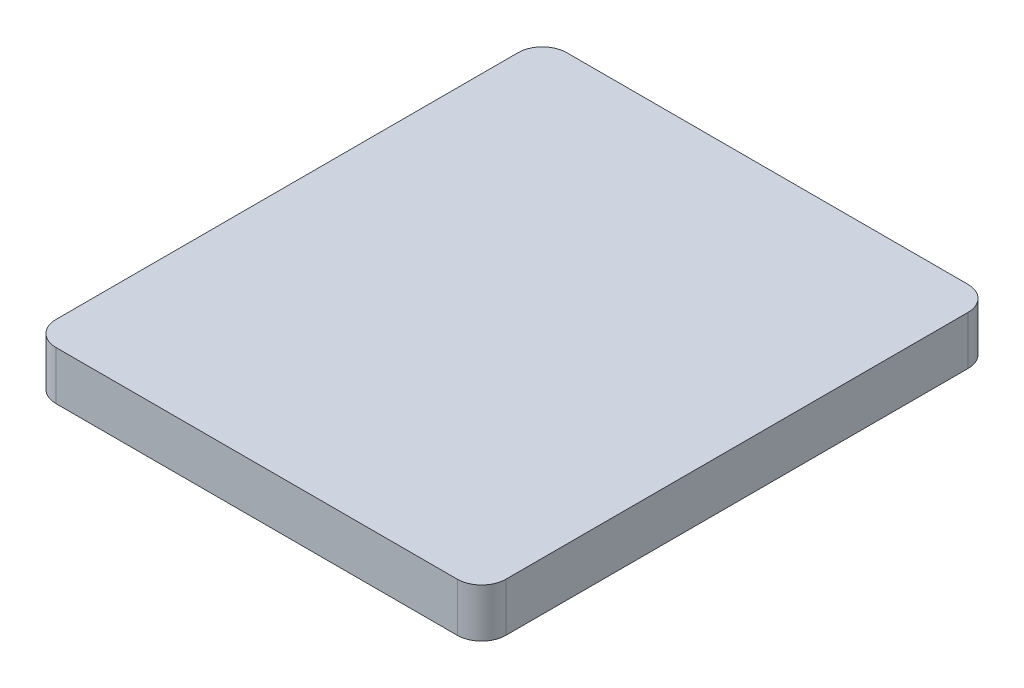
ISO-10303-21;
HEADER;
FILE_DESCRIPTION(('STEP AP214'),'2;1');
FILE_NAME('part.step','',(''),(''),'','','');
FILE_SCHEMA(('AUTOMOTIVE_DESIGN { 1 0 10303 214 1 1 1 1 }'));
ENDSEC;
DATA;
#1=APPLICATION_CONTEXT('core data for automotive mechanical design processes');
#2=APPLICATION_PROTOCOL_DEFINITION('international standard','automotive_design',2000,#1);
#3=PRODUCT_CONTEXT('',#1,'mechanical');
#4=PRODUCT('Part','Part','',(#3));
#5=PRODUCT_RELATED_PRODUCT_CATEGORY('part','',(#4));
#6=PRODUCT_DEFINITION_FORMATION('','',#4);
#7=PRODUCT_DEFINITION_CONTEXT('part definition',#1,'design');
#8=PRODUCT_DEFINITION('design','',#6,#7);
#9=PRODUCT_DEFINITION_SHAPE('','',#8);
#10=(LENGTH_UNIT() NAMED_UNIT(*) SI_UNIT(.MILLI.,.METRE.));
#11=(NAMED_UNIT(*) PLANE_ANGLE_UNIT() SI_UNIT($,.RADIAN.));
#12=(NAMED_UNIT(*) SI_UNIT($,.STERADIAN.) SOLID_ANGLE_UNIT());
#13=UNCERTAINTY_MEASURE_WITH_UNIT(LENGTH_MEASURE(1.E-05),#10,'distance_accuracy_value','');
#14=(GEOMETRIC_REPRESENTATION_CONTEXT(3) GLOBAL_UNCERTAINTY_ASSIGNED_CONTEXT((#13)) GLOBAL_UNIT_ASSIGNED_CONTEXT((#10,
#11,#12)) REPRESENTATION_CONTEXT('',''));
#15=CARTESIAN_POINT('',(0.,0.,0.));
#16=DIRECTION('',(0.,0.,1.));
#17=DIRECTION('',(1.,0.,0.));
#18=AXIS2_PLACEMENT_3D('',#15,#16,#17);
#19=CARTESIAN_POINT('',(0.,2.,0.));
#20=DIRECTION('',(1.,0.,0.));
#21=DIRECTION('',(0.,0.,-1.));
#22=AXIS2_PLACEMENT_3D('',#19,#20,#21);
#23=PLANE('',#22);
#24=DIRECTION('',(0.,0.,1.));
#25=VECTOR('',#24,1.);
#26=CARTESIAN_POINT('',(0.,2.,0.));
#27=LINE('',#26,#25);
#28=CARTESIAN_POINT('',(0.,2.,-20.));
#29=VERTEX_POINT('',#28);
#30=CARTESIAN_POINT('',(0.,2.,-1.));
#31=VERTEX_POINT('',#30);
#32=EDGE_CURVE('E123',#29,#31,#27,.T.);
#33=ORIENTED_EDGE('',*,*,#32,.F.);
#34=DIRECTION('',(0.,-1.,0.));
#35=VECTOR('',#34,1.);
#36=CARTESIAN_POINT('',(0.,2.,-20.));
#37=LINE('',#36,#35);
#38=CARTESIAN_POINT('',(0.,0.,-20.));
#39=VERTEX_POINT('',#38);
#40=EDGE_CURVE('E108',#29,#39,#37,.T.);
#41=ORIENTED_EDGE('',*,*,#40,.T.);
#42=DIRECTION('',(0.,0.,1.));
#43=VECTOR('',#42,1.);
#44=CARTESIAN_POINT('',(0.,0.,0.));
#45=LINE('',#44,#43);
#46=CARTESIAN_POINT('',(0.,0.,-1.));
#47=VERTEX_POINT('',#46);
#48=EDGE_CURVE('E120',#39,#47,#45,.T.);
#49=ORIENTED_EDGE('',*,*,#48,.T.);
#50=DIRECTION('',(0.,-1.,0.));
#51=VECTOR('',#50,1.);
#52=CARTESIAN_POINT('',(0.,2.,-1.));
#53=LINE('',#52,#51);
#54=EDGE_CURVE('E125',#47,#31,#53,.F.);
#55=ORIENTED_EDGE('',*,*,#54,.T.);
#56=EDGE_LOOP('',(#33,#41,#49,#55));
#57=FACE_BOUND('',#56,.T.);
#58=ADVANCED_FACE('F38',(#57),#23,.F.);
#59=CARTESIAN_POINT('',(0.,2.,0.));
#60=DIRECTION('',(0.,0.,-1.));
#61=DIRECTION('',(-1.,0.,0.));
#62=AXIS2_PLACEMENT_3D('',#59,#60,#61);
#63=PLANE('',#62);
#64=DIRECTION('',(1.,0.,0.));
#65=VECTOR('',#64,1.);
#66=CARTESIAN_POINT('',(0.,0.,0.));
#67=LINE('',#66,#65);
#68=CARTESIAN_POINT('',(1.,0.,0.));
#69=VERTEX_POINT('',#68);
#70=CARTESIAN_POINT('',(17.5,0.,0.));
#71=VERTEX_POINT('',#70);
#72=EDGE_CURVE('E129',#69,#71,#67,.T.);
#73=ORIENTED_EDGE('',*,*,#72,.T.);
#74=DIRECTION('',(0.,-1.,0.));
#75=VECTOR('',#74,1.);
#76=CARTESIAN_POINT('',(17.5,2.,0.));
#77=LINE('',#76,#75);
#78=CARTESIAN_POINT('',(17.5,2.,0.));
#79=VERTEX_POINT('',#78);
#80=EDGE_CURVE('E11',#71,#79,#77,.F.);
#81=ORIENTED_EDGE('',*,*,#80,.T.);
#82=DIRECTION('',(1.,0.,0.));
#83=VECTOR('',#82,1.);
#84=CARTESIAN_POINT('',(0.,2.,0.));
#85=LINE('',#84,#83);
#86=CARTESIAN_POINT('',(1.,2.,0.));
#87=VERTEX_POINT('',#86);
#88=EDGE_CURVE('E165',#87,#79,#85,.T.);
#89=ORIENTED_EDGE('',*,*,#88,.F.);
#90=DIRECTION('',(0.,-1.,0.));
#91=VECTOR('',#90,1.);
#92=CARTESIAN_POINT('',(1.,2.,0.));
#93=LINE('',#92,#91);
#94=EDGE_CURVE('E46',#87,#69,#93,.T.);
#95=ORIENTED_EDGE('',*,*,#94,.T.);
#96=EDGE_LOOP('',(#73,#81,#89,#95));
#97=FACE_BOUND('',#96,.T.);
#98=ADVANCED_FACE('F163',(#97),#63,.F.);
#99=CARTESIAN_POINT('',(18.5,2.,0.));
#100=DIRECTION('',(-1.,0.,0.));
#101=DIRECTION('',(0.,0.,1.));
#102=AXIS2_PLACEMENT_3D('',#99,#100,#101);
#103=PLANE('',#102);
#104=DIRECTION('',(0.,0.,-1.));
#105=VECTOR('',#104,1.);
#106=CARTESIAN_POINT('',(18.5,0.,0.));
#107=LINE('',#106,#105);
#108=CARTESIAN_POINT('',(18.5,0.,-1.));
#109=VERTEX_POINT('',#108);
#110=CARTESIAN_POINT('',(18.5,0.,-20.));
#111=VERTEX_POINT('',#110);
#112=EDGE_CURVE('E132',#109,#111,#107,.T.);
#113=ORIENTED_EDGE('',*,*,#112,.T.);
#114=DIRECTION('',(0.,-1.,0.));
#115=VECTOR('',#114,1.);
#116=CARTESIAN_POINT('',(18.5,2.,-20.));
#117=LINE('',#116,#115);
#118=CARTESIAN_POINT('',(18.5,2.,-20.));
#119=VERTEX_POINT('',#118);
#120=EDGE_CURVE('E53',#111,#119,#117,.F.);
#121=ORIENTED_EDGE('',*,*,#120,.T.);
#122=DIRECTION('',(0.,0.,-1.));
#123=VECTOR('',#122,1.);
#124=CARTESIAN_POINT('',(18.5,2.,0.));
#125=LINE('',#124,#123);
#126=CARTESIAN_POINT('',(18.5,2.,-1.));
#127=VERTEX_POINT('',#126);
#128=EDGE_CURVE('E173',#127,#119,#125,.T.);
#129=ORIENTED_EDGE('',*,*,#128,.F.);
#130=DIRECTION('',(0.,-1.,0.));
#131=VECTOR('',#130,1.);
#132=CARTESIAN_POINT('',(18.5,2.,-1.));
#133=LINE('',#132,#131);
#134=EDGE_CURVE('E156',#127,#109,#133,.T.);
#135=ORIENTED_EDGE('',*,*,#134,.T.);
#136=EDGE_LOOP('',(#113,#121,#129,#135));
#137=FACE_BOUND('',#136,.T.);
#138=ADVANCED_FACE('F172',(#137),#103,.F.);
#139=CARTESIAN_POINT('',(0.,2.,-21.));
#140=DIRECTION('',(0.,0.,1.));
#141=DIRECTION('',(1.,0.,0.));
#142=AXIS2_PLACEMENT_3D('',#139,#140,#141);
#143=PLANE('',#142);
#144=DIRECTION('',(-1.,0.,0.));
#145=VECTOR('',#144,1.);
#146=CARTESIAN_POINT('',(0.,0.,-21.));
#147=LINE('',#146,#145);
#148=CARTESIAN_POINT('',(17.5,0.,-21.));
#149=VERTEX_POINT('',#148);
#150=CARTESIAN_POINT('',(1.,0.,-21.));
#151=VERTEX_POINT('',#150);
#152=EDGE_CURVE('E139',#149,#151,#147,.T.);
#153=ORIENTED_EDGE('',*,*,#152,.T.);
#154=DIRECTION('',(0.,-1.,0.));
#155=VECTOR('',#154,1.);
#156=CARTESIAN_POINT('',(1.,2.,-21.));
#157=LINE('',#156,#155);
#158=CARTESIAN_POINT('',(1.,2.,-21.));
#159=VERTEX_POINT('',#158);
#160=EDGE_CURVE('E109',#151,#159,#157,.F.);
#161=ORIENTED_EDGE('',*,*,#160,.T.);
#162=DIRECTION('',(-1.,0.,0.));
#163=VECTOR('',#162,1.);
#164=CARTESIAN_POINT('',(0.,2.,-21.));
#165=LINE('',#164,#163);
#166=CARTESIAN_POINT('',(17.5,2.,-21.));
#167=VERTEX_POINT('',#166);
#168=EDGE_CURVE('E135',#167,#159,#165,.T.);
#169=ORIENTED_EDGE('',*,*,#168,.F.);
#170=DIRECTION('',(0.,-1.,0.));
#171=VECTOR('',#170,1.);
#172=CARTESIAN_POINT('',(17.5,2.,-21.));
#173=LINE('',#172,#171);
#174=EDGE_CURVE('E114',#167,#149,#173,.T.);
#175=ORIENTED_EDGE('',*,*,#174,.T.);
#176=EDGE_LOOP('',(#153,#161,#169,#175));
#177=FACE_BOUND('',#176,.T.);
#178=ADVANCED_FACE('F201',(#177),#143,.F.);
#179=CARTESIAN_POINT('',(0.,2.,0.));
#180=DIRECTION('',(0.,-1.,0.));
#181=DIRECTION('',(0.,0.,-1.));
#182=AXIS2_PLACEMENT_3D('',#179,#180,#181);
#183=PLANE('',#182);
#184=ORIENTED_EDGE('',*,*,#168,.T.);
#185=CARTESIAN_POINT('',(1.,2.,-20.));
#186=DIRECTION('',(0.,-1.,0.));
#187=DIRECTION('',(0.,0.,-1.));
#188=AXIS2_PLACEMENT_3D('',#185,#186,#187);
#189=CIRCLE('',#188,1.);
#190=EDGE_CURVE('E154',#159,#29,#189,.F.);
#191=ORIENTED_EDGE('',*,*,#190,.T.);
#192=ORIENTED_EDGE('',*,*,#32,.T.);
#193=CARTESIAN_POINT('',(1.,2.,-1.));
#194=DIRECTION('',(0.,-1.,0.));
#195=DIRECTION('',(0.,0.,-1.));
#196=AXIS2_PLACEMENT_3D('',#193,#194,#195);
#197=CIRCLE('',#196,1.);
#198=EDGE_CURVE('E149',#31,#87,#197,.F.);
#199=ORIENTED_EDGE('',*,*,#198,.T.);
#200=ORIENTED_EDGE('',*,*,#88,.T.);
#201=CARTESIAN_POINT('',(17.5,2.,-1.));
#202=DIRECTION('',(0.,-1.,0.));
#203=DIRECTION('',(0.,0.,-1.));
#204=AXIS2_PLACEMENT_3D('',#201,#202,#203);
#205=CIRCLE('',#204,1.);
#206=EDGE_CURVE('E60',#79,#127,#205,.F.);
#207=ORIENTED_EDGE('',*,*,#206,.T.);
#208=ORIENTED_EDGE('',*,*,#128,.T.);
#209=CARTESIAN_POINT('',(17.5,2.,-20.));
#210=DIRECTION('',(0.,-1.,0.));
#211=DIRECTION('',(0.,0.,-1.));
#212=AXIS2_PLACEMENT_3D('',#209,#210,#211);
#213=CIRCLE('',#212,1.);
#214=EDGE_CURVE('E152',#119,#167,#213,.F.);
#215=ORIENTED_EDGE('',*,*,#214,.T.);
#216=EDGE_LOOP('',(#184,#191,#192,#199,#200,#207,#208,#215));
#217=FACE_BOUND('',#216,.T.);
#218=ADVANCED_FACE('F178',(#217),#183,.F.);
#219=CARTESIAN_POINT('',(0.,0.,0.));
#220=DIRECTION('',(0.,-1.,0.));
#221=DIRECTION('',(0.,0.,-1.));
#222=AXIS2_PLACEMENT_3D('',#219,#220,#221);
#223=PLANE('',#222);
#224=ORIENTED_EDGE('',*,*,#48,.F.);
#225=CARTESIAN_POINT('',(1.,0.,-20.));
#226=DIRECTION('',(0.,-1.,0.));
#227=DIRECTION('',(0.,0.,-1.));
#228=AXIS2_PLACEMENT_3D('',#225,#226,#227);
#229=CIRCLE('',#228,1.);
#230=EDGE_CURVE('E104',#39,#151,#229,.T.);
#231=ORIENTED_EDGE('',*,*,#230,.T.);
#232=ORIENTED_EDGE('',*,*,#152,.F.);
#233=CARTESIAN_POINT('',(17.5,0.,-20.));
#234=DIRECTION('',(0.,-1.,0.));
#235=DIRECTION('',(0.,0.,-1.));
#236=AXIS2_PLACEMENT_3D('',#233,#234,#235);
#237=CIRCLE('',#236,1.);
#238=EDGE_CURVE('E115',#149,#111,#237,.T.);
#239=ORIENTED_EDGE('',*,*,#238,.T.);
#240=ORIENTED_EDGE('',*,*,#112,.F.);
#241=CARTESIAN_POINT('',(17.5,0.,-1.));
#242=DIRECTION('',(0.,-1.,0.));
#243=DIRECTION('',(0.,0.,-1.));
#244=AXIS2_PLACEMENT_3D('',#241,#242,#243);
#245=CIRCLE('',#244,1.);
#246=EDGE_CURVE('E143',#109,#71,#245,.T.);
#247=ORIENTED_EDGE('',*,*,#246,.T.);
#248=ORIENTED_EDGE('',*,*,#72,.F.);
#249=CARTESIAN_POINT('',(1.,0.,-1.));
#250=DIRECTION('',(0.,-1.,0.));
#251=DIRECTION('',(0.,0.,-1.));
#252=AXIS2_PLACEMENT_3D('',#249,#250,#251);
#253=CIRCLE('',#252,1.);
#254=EDGE_CURVE('E124',#69,#47,#253,.T.);
#255=ORIENTED_EDGE('',*,*,#254,.T.);
#256=EDGE_LOOP('',(#224,#231,#232,#239,#240,#247,#248,#255));
#257=FACE_BOUND('',#256,.T.);
#258=ADVANCED_FACE('F127',(#257),#223,.T.);
#259=CARTESIAN_POINT('',(1.,2.,-20.));
#260=DIRECTION('',(0.,-1.,0.));
#261=DIRECTION('',(0.,0.,-1.));
#262=AXIS2_PLACEMENT_3D('',#259,#260,#261);
#263=CYLINDRICAL_SURFACE('',#262,1.);
#264=ORIENTED_EDGE('',*,*,#190,.F.);
#265=ORIENTED_EDGE('',*,*,#160,.F.);
#266=ORIENTED_EDGE('',*,*,#230,.F.);
#267=ORIENTED_EDGE('',*,*,#40,.F.);
#268=EDGE_LOOP('',(#264,#265,#266,#267));
#269=FACE_BOUND('',#268,.T.);
#270=ADVANCED_FACE('F107',(#269),#263,.T.);
#271=CARTESIAN_POINT('',(17.5,2.,-20.));
#272=DIRECTION('',(0.,-1.,0.));
#273=DIRECTION('',(0.,0.,-1.));
#274=AXIS2_PLACEMENT_3D('',#271,#272,#273);
#275=CYLINDRICAL_SURFACE('',#274,1.);
#276=ORIENTED_EDGE('',*,*,#214,.F.);
#277=ORIENTED_EDGE('',*,*,#120,.F.);
#278=ORIENTED_EDGE('',*,*,#238,.F.);
#279=ORIENTED_EDGE('',*,*,#174,.F.);
#280=EDGE_LOOP('',(#276,#277,#278,#279));
#281=FACE_BOUND('',#280,.T.);
#282=ADVANCED_FACE('F183',(#281),#275,.T.);
#283=CARTESIAN_POINT('',(17.5,2.,-1.));
#284=DIRECTION('',(0.,-1.,0.));
#285=DIRECTION('',(0.,0.,-1.));
#286=AXIS2_PLACEMENT_3D('',#283,#284,#285);
#287=CYLINDRICAL_SURFACE('',#286,1.);
#288=ORIENTED_EDGE('',*,*,#206,.F.);
#289=ORIENTED_EDGE('',*,*,#80,.F.);
#290=ORIENTED_EDGE('',*,*,#246,.F.);
#291=ORIENTED_EDGE('',*,*,#134,.F.);
#292=EDGE_LOOP('',(#288,#289,#290,#291));
#293=FACE_BOUND('',#292,.T.);
#294=ADVANCED_FACE('F171',(#293),#287,.T.);
#295=CARTESIAN_POINT('',(1.,2.,-1.));
#296=DIRECTION('',(0.,-1.,0.));
#297=DIRECTION('',(0.,0.,-1.));
#298=AXIS2_PLACEMENT_3D('',#295,#296,#297);
#299=CYLINDRICAL_SURFACE('',#298,1.);
#300=ORIENTED_EDGE('',*,*,#198,.F.);
#301=ORIENTED_EDGE('',*,*,#54,.F.);
#302=ORIENTED_EDGE('',*,*,#254,.F.);
#303=ORIENTED_EDGE('',*,*,#94,.F.);
#304=EDGE_LOOP('',(#300,#301,#302,#303));
#305=FACE_BOUND('',#304,.T.);
#306=ADVANCED_FACE('F40',(#305),#299,.T.);
#307=CLOSED_SHELL('',(#58,#98,#138,#178,#218,#258,#270,#282,#294,#306));
#308=MANIFOLD_SOLID_BREP('B2',#307);
#309=ADVANCED_BREP_SHAPE_REPRESENTATION('',(#18,#308),#14);
#310=SHAPE_DEFINITION_REPRESENTATION(#9,#309);
ENDSEC;
END-ISO-10303-21;
